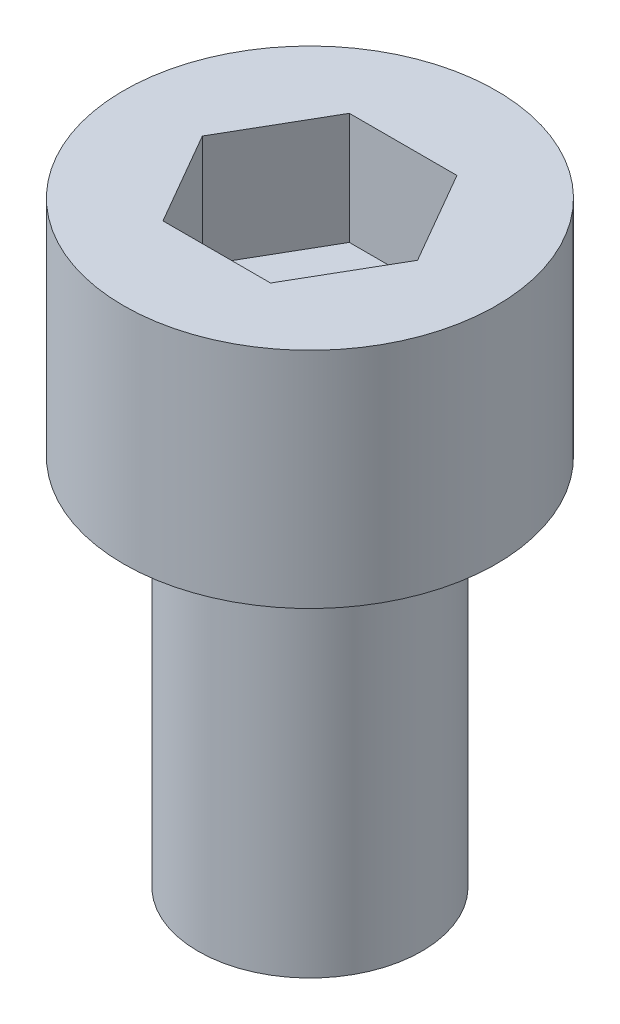
ISO-10303-21;
HEADER;
FILE_DESCRIPTION(('STEP AP214'),'2;1');
FILE_NAME('part.step','',(''),(''),'','','');
FILE_SCHEMA(('AUTOMOTIVE_DESIGN { 1 0 10303 214 1 1 1 1 }'));
ENDSEC;
DATA;
#1=APPLICATION_CONTEXT('core data for automotive mechanical design processes');
#2=APPLICATION_PROTOCOL_DEFINITION('international standard','automotive_design',2000,#1);
#3=PRODUCT_CONTEXT('',#1,'mechanical');
#4=PRODUCT('Part','Part','',(#3));
#5=PRODUCT_RELATED_PRODUCT_CATEGORY('part','',(#4));
#6=PRODUCT_DEFINITION_FORMATION('','',#4);
#7=PRODUCT_DEFINITION_CONTEXT('part definition',#1,'design');
#8=PRODUCT_DEFINITION('design','',#6,#7);
#9=PRODUCT_DEFINITION_SHAPE('','',#8);
#10=(LENGTH_UNIT() NAMED_UNIT(*) SI_UNIT(.MILLI.,.METRE.));
#11=(NAMED_UNIT(*) PLANE_ANGLE_UNIT() SI_UNIT($,.RADIAN.));
#12=(NAMED_UNIT(*) SI_UNIT($,.STERADIAN.) SOLID_ANGLE_UNIT());
#13=UNCERTAINTY_MEASURE_WITH_UNIT(LENGTH_MEASURE(1.E-05),#10,'distance_accuracy_value','');
#14=(GEOMETRIC_REPRESENTATION_CONTEXT(3) GLOBAL_UNCERTAINTY_ASSIGNED_CONTEXT((#13)) GLOBAL_UNIT_ASSIGNED_CONTEXT((#10,
#11,#12)) REPRESENTATION_CONTEXT('',''));
#15=CARTESIAN_POINT('',(0.,0.,0.));
#16=DIRECTION('',(0.,0.,1.));
#17=DIRECTION('',(1.,0.,0.));
#18=AXIS2_PLACEMENT_3D('',#15,#16,#17);
#19=CARTESIAN_POINT('',(0.,-10.,0.));
#20=DIRECTION('',(0.,1.,0.));
#21=DIRECTION('',(0.,0.,1.));
#22=AXIS2_PLACEMENT_3D('',#19,#20,#21);
#23=PLANE('',#22);
#24=CARTESIAN_POINT('',(0.,-9.99999999999999,0.));
#25=DIRECTION('',(0.,1.,0.));
#26=DIRECTION('',(0.,0.,1.));
#27=AXIS2_PLACEMENT_3D('',#24,#25,#26);
#28=CIRCLE('',#27,3.00000000000001);
#29=CARTESIAN_POINT('',(0.,-9.99999999999999,3.00000000000001));
#30=VERTEX_POINT('',#29);
#31=EDGE_CURVE('E11',#30,#30,#28,.T.);
#32=ORIENTED_EDGE('',*,*,#31,.F.);
#33=EDGE_LOOP('',(#32));
#34=FACE_BOUND('',#33,.T.);
#35=ADVANCED_FACE('F35',(#34),#23,.F.);
#36=CARTESIAN_POINT('',(0.,61.6916426261037,0.));
#37=DIRECTION('',(0.,1.,0.));
#38=DIRECTION('',(0.,0.,1.));
#39=AXIS2_PLACEMENT_3D('',#36,#37,#38);
#40=CYLINDRICAL_SURFACE('',#39,3.00000000000001);
#41=CARTESIAN_POINT('',(0.,0.,0.));
#42=DIRECTION('',(0.,1.,0.));
#43=DIRECTION('',(0.,0.,1.));
#44=AXIS2_PLACEMENT_3D('',#41,#42,#43);
#45=CIRCLE('',#44,3.00000000000001);
#46=CARTESIAN_POINT('',(0.,0.,3.00000000000001));
#47=VERTEX_POINT('',#46);
#48=EDGE_CURVE('E42',#47,#47,#45,.T.);
#49=ORIENTED_EDGE('',*,*,#48,.F.);
#50=EDGE_LOOP('',(#49));
#51=FACE_BOUND('',#50,.T.);
#52=ORIENTED_EDGE('',*,*,#31,.T.);
#53=EDGE_LOOP('',(#52));
#54=FACE_BOUND('',#53,.T.);
#55=ADVANCED_FACE('F151',(#51,#54),#40,.T.);
#56=CARTESIAN_POINT('',(3.00000000000001,0.,0.));
#57=DIRECTION('',(0.,1.,0.));
#58=DIRECTION('',(0.,0.,1.));
#59=AXIS2_PLACEMENT_3D('',#56,#57,#58);
#60=PLANE('',#59);
#61=CARTESIAN_POINT('',(0.,0.,0.));
#62=DIRECTION('',(0.,1.,0.));
#63=DIRECTION('',(0.,0.,1.));
#64=AXIS2_PLACEMENT_3D('',#61,#62,#63);
#65=CIRCLE('',#64,5.00000000000001);
#66=CARTESIAN_POINT('',(0.,0.,5.00000000000001));
#67=VERTEX_POINT('',#66);
#68=EDGE_CURVE('E144',#67,#67,#65,.T.);
#69=ORIENTED_EDGE('',*,*,#68,.F.);
#70=EDGE_LOOP('',(#69));
#71=FACE_BOUND('',#70,.T.);
#72=ORIENTED_EDGE('',*,*,#48,.T.);
#73=EDGE_LOOP('',(#72));
#74=FACE_BOUND('',#73,.T.);
#75=ADVANCED_FACE('F149',(#71,#74),#60,.F.);
#76=CARTESIAN_POINT('',(0.,61.6916426261037,0.));
#77=DIRECTION('',(0.,1.,0.));
#78=DIRECTION('',(0.,0.,1.));
#79=AXIS2_PLACEMENT_3D('',#76,#77,#78);
#80=CYLINDRICAL_SURFACE('',#79,5.00000000000001);
#81=CARTESIAN_POINT('',(0.,6.,0.));
#82=DIRECTION('',(0.,1.,0.));
#83=DIRECTION('',(0.,0.,1.));
#84=AXIS2_PLACEMENT_3D('',#81,#82,#83);
#85=CIRCLE('',#84,5.00000000000001);
#86=CARTESIAN_POINT('',(0.,6.,5.00000000000001));
#87=VERTEX_POINT('',#86);
#88=EDGE_CURVE('E136',#87,#87,#85,.T.);
#89=ORIENTED_EDGE('',*,*,#88,.F.);
#90=EDGE_LOOP('',(#89));
#91=FACE_BOUND('',#90,.T.);
#92=ORIENTED_EDGE('',*,*,#68,.T.);
#93=EDGE_LOOP('',(#92));
#94=FACE_BOUND('',#93,.T.);
#95=ADVANCED_FACE('F169',(#91,#94),#80,.T.);
#96=CARTESIAN_POINT('',(5.00000000000001,6.,0.));
#97=DIRECTION('',(0.,-1.,0.));
#98=DIRECTION('',(0.,0.,-1.));
#99=AXIS2_PLACEMENT_3D('',#96,#97,#98);
#100=PLANE('',#99);
#101=DIRECTION('',(-1.,0.,0.));
#102=VECTOR('',#101,1.);
#103=CARTESIAN_POINT('',(1.44337567297406,6.,-2.5));
#104=LINE('',#103,#102);
#105=CARTESIAN_POINT('',(1.44337567297406,6.,-2.5));
#106=VERTEX_POINT('',#105);
#107=CARTESIAN_POINT('',(-1.44337567297406,6.,-2.5));
#108=VERTEX_POINT('',#107);
#109=EDGE_CURVE('E123',#106,#108,#104,.T.);
#110=ORIENTED_EDGE('',*,*,#109,.F.);
#111=DIRECTION('',(-0.5,0.,-0.866025403784439));
#112=VECTOR('',#111,1.);
#113=CARTESIAN_POINT('',(2.88675134594813,6.,0.));
#114=LINE('',#113,#112);
#115=CARTESIAN_POINT('',(2.88675134594813,6.,0.));
#116=VERTEX_POINT('',#115);
#117=EDGE_CURVE('E49',#116,#106,#114,.T.);
#118=ORIENTED_EDGE('',*,*,#117,.F.);
#119=DIRECTION('',(0.5,0.,-0.866025403784439));
#120=VECTOR('',#119,1.);
#121=CARTESIAN_POINT('',(1.44337567297406,6.,2.5));
#122=LINE('',#121,#120);
#123=CARTESIAN_POINT('',(1.44337567297406,6.,2.5));
#124=VERTEX_POINT('',#123);
#125=EDGE_CURVE('E132',#124,#116,#122,.T.);
#126=ORIENTED_EDGE('',*,*,#125,.F.);
#127=DIRECTION('',(1.,0.,0.));
#128=VECTOR('',#127,1.);
#129=CARTESIAN_POINT('',(-1.44337567297406,6.,2.5));
#130=LINE('',#129,#128);
#131=CARTESIAN_POINT('',(-1.44337567297406,6.,2.5));
#132=VERTEX_POINT('',#131);
#133=EDGE_CURVE('E130',#132,#124,#130,.T.);
#134=ORIENTED_EDGE('',*,*,#133,.F.);
#135=DIRECTION('',(0.5,0.,0.866025403784438));
#136=VECTOR('',#135,1.);
#137=CARTESIAN_POINT('',(-2.88675134594813,6.,0.));
#138=LINE('',#137,#136);
#139=CARTESIAN_POINT('',(-2.88675134594813,6.,0.));
#140=VERTEX_POINT('',#139);
#141=EDGE_CURVE('E97',#140,#132,#138,.T.);
#142=ORIENTED_EDGE('',*,*,#141,.F.);
#143=DIRECTION('',(-0.5,0.,0.866025403784439));
#144=VECTOR('',#143,1.);
#145=CARTESIAN_POINT('',(-1.44337567297406,6.,-2.5));
#146=LINE('',#145,#144);
#147=EDGE_CURVE('E126',#108,#140,#146,.T.);
#148=ORIENTED_EDGE('',*,*,#147,.F.);
#149=EDGE_LOOP('',(#110,#118,#126,#134,#142,#148));
#150=FACE_BOUND('',#149,.T.);
#151=ORIENTED_EDGE('',*,*,#88,.T.);
#152=EDGE_LOOP('',(#151));
#153=FACE_BOUND('',#152,.T.);
#154=ADVANCED_FACE('F177',(#150,#153),#100,.F.);
#155=CARTESIAN_POINT('',(2.88675134594813,3.,0.));
#156=DIRECTION('',(0.866025403784439,0.,-0.5));
#157=DIRECTION('',(-0.5,0.,-0.866025403784439));
#158=AXIS2_PLACEMENT_3D('',#155,#156,#157);
#159=PLANE('',#158);
#160=ORIENTED_EDGE('',*,*,#117,.T.);
#161=DIRECTION('',(0.,1.,0.));
#162=VECTOR('',#161,1.);
#163=CARTESIAN_POINT('',(1.44337567297406,3.,-2.5));
#164=LINE('',#163,#162);
#165=CARTESIAN_POINT('',(1.44337567297406,3.,-2.5));
#166=VERTEX_POINT('',#165);
#167=EDGE_CURVE('E79',#166,#106,#164,.T.);
#168=ORIENTED_EDGE('',*,*,#167,.F.);
#169=DIRECTION('',(-0.5,0.,-0.866025403784439));
#170=VECTOR('',#169,1.);
#171=CARTESIAN_POINT('',(2.88675134594813,3.,0.));
#172=LINE('',#171,#170);
#173=CARTESIAN_POINT('',(2.88675134594813,3.,0.));
#174=VERTEX_POINT('',#173);
#175=EDGE_CURVE('E134',#174,#166,#172,.T.);
#176=ORIENTED_EDGE('',*,*,#175,.F.);
#177=DIRECTION('',(0.,1.,0.));
#178=VECTOR('',#177,1.);
#179=CARTESIAN_POINT('',(2.88675134594813,3.,0.));
#180=LINE('',#179,#178);
#181=EDGE_CURVE('E57',#174,#116,#180,.T.);
#182=ORIENTED_EDGE('',*,*,#181,.T.);
#183=EDGE_LOOP('',(#160,#168,#176,#182));
#184=FACE_BOUND('',#183,.T.);
#185=ADVANCED_FACE('F185',(#184),#159,.F.);
#186=CARTESIAN_POINT('',(1.44337567297406,3.,2.5));
#187=DIRECTION('',(0.866025403784439,0.,0.5));
#188=DIRECTION('',(0.5,0.,-0.866025403784439));
#189=AXIS2_PLACEMENT_3D('',#186,#187,#188);
#190=PLANE('',#189);
#191=ORIENTED_EDGE('',*,*,#125,.T.);
#192=ORIENTED_EDGE('',*,*,#181,.F.);
#193=DIRECTION('',(0.5,0.,-0.866025403784439));
#194=VECTOR('',#193,1.);
#195=CARTESIAN_POINT('',(1.44337567297406,3.,2.5));
#196=LINE('',#195,#194);
#197=CARTESIAN_POINT('',(1.44337567297406,3.,2.5));
#198=VERTEX_POINT('',#197);
#199=EDGE_CURVE('E109',#198,#174,#196,.T.);
#200=ORIENTED_EDGE('',*,*,#199,.F.);
#201=DIRECTION('',(0.,1.,0.));
#202=VECTOR('',#201,1.);
#203=CARTESIAN_POINT('',(1.44337567297406,3.,2.5));
#204=LINE('',#203,#202);
#205=EDGE_CURVE('E101',#198,#124,#204,.T.);
#206=ORIENTED_EDGE('',*,*,#205,.T.);
#207=EDGE_LOOP('',(#191,#192,#200,#206));
#208=FACE_BOUND('',#207,.T.);
#209=ADVANCED_FACE('F193',(#208),#190,.F.);
#210=CARTESIAN_POINT('',(-1.44337567297406,3.,2.5));
#211=DIRECTION('',(0.,0.,1.));
#212=DIRECTION('',(1.,0.,0.));
#213=AXIS2_PLACEMENT_3D('',#210,#211,#212);
#214=PLANE('',#213);
#215=ORIENTED_EDGE('',*,*,#133,.T.);
#216=ORIENTED_EDGE('',*,*,#205,.F.);
#217=DIRECTION('',(1.,0.,0.));
#218=VECTOR('',#217,1.);
#219=CARTESIAN_POINT('',(-1.44337567297406,3.,2.5));
#220=LINE('',#219,#218);
#221=CARTESIAN_POINT('',(-1.44337567297406,3.,2.5));
#222=VERTEX_POINT('',#221);
#223=EDGE_CURVE('E105',#222,#198,#220,.T.);
#224=ORIENTED_EDGE('',*,*,#223,.F.);
#225=DIRECTION('',(0.,1.,0.));
#226=VECTOR('',#225,1.);
#227=CARTESIAN_POINT('',(-1.44337567297406,3.,2.5));
#228=LINE('',#227,#226);
#229=EDGE_CURVE('E90',#222,#132,#228,.T.);
#230=ORIENTED_EDGE('',*,*,#229,.T.);
#231=EDGE_LOOP('',(#215,#216,#224,#230));
#232=FACE_BOUND('',#231,.T.);
#233=ADVANCED_FACE('F106',(#232),#214,.F.);
#234=CARTESIAN_POINT('',(-2.88675134594813,3.,0.));
#235=DIRECTION('',(-0.866025403784438,0.,0.5));
#236=DIRECTION('',(0.5,0.,0.866025403784439));
#237=AXIS2_PLACEMENT_3D('',#234,#235,#236);
#238=PLANE('',#237);
#239=ORIENTED_EDGE('',*,*,#141,.T.);
#240=ORIENTED_EDGE('',*,*,#229,.F.);
#241=DIRECTION('',(0.5,0.,0.866025403784438));
#242=VECTOR('',#241,1.);
#243=CARTESIAN_POINT('',(-2.88675134594813,3.,0.));
#244=LINE('',#243,#242);
#245=CARTESIAN_POINT('',(-2.88675134594813,3.,0.));
#246=VERTEX_POINT('',#245);
#247=EDGE_CURVE('E94',#246,#222,#244,.T.);
#248=ORIENTED_EDGE('',*,*,#247,.F.);
#249=DIRECTION('',(0.,1.,0.));
#250=VECTOR('',#249,1.);
#251=CARTESIAN_POINT('',(-2.88675134594813,3.,0.));
#252=LINE('',#251,#250);
#253=EDGE_CURVE('E102',#246,#140,#252,.T.);
#254=ORIENTED_EDGE('',*,*,#253,.T.);
#255=EDGE_LOOP('',(#239,#240,#248,#254));
#256=FACE_BOUND('',#255,.T.);
#257=ADVANCED_FACE('F92',(#256),#238,.F.);
#258=CARTESIAN_POINT('',(-1.44337567297406,3.,-2.5));
#259=DIRECTION('',(-0.866025403784439,0.,-0.5));
#260=DIRECTION('',(-0.5,0.,0.866025403784439));
#261=AXIS2_PLACEMENT_3D('',#258,#259,#260);
#262=PLANE('',#261);
#263=ORIENTED_EDGE('',*,*,#147,.T.);
#264=ORIENTED_EDGE('',*,*,#253,.F.);
#265=DIRECTION('',(-0.5,0.,0.866025403784439));
#266=VECTOR('',#265,1.);
#267=CARTESIAN_POINT('',(-1.44337567297406,3.,-2.5));
#268=LINE('',#267,#266);
#269=CARTESIAN_POINT('',(-1.44337567297406,3.,-2.5));
#270=VERTEX_POINT('',#269);
#271=EDGE_CURVE('E115',#270,#246,#268,.T.);
#272=ORIENTED_EDGE('',*,*,#271,.F.);
#273=DIRECTION('',(0.,1.,0.));
#274=VECTOR('',#273,1.);
#275=CARTESIAN_POINT('',(-1.44337567297406,3.,-2.5));
#276=LINE('',#275,#274);
#277=EDGE_CURVE('E139',#270,#108,#276,.T.);
#278=ORIENTED_EDGE('',*,*,#277,.T.);
#279=EDGE_LOOP('',(#263,#264,#272,#278));
#280=FACE_BOUND('',#279,.T.);
#281=ADVANCED_FACE('F212',(#280),#262,.F.);
#282=CARTESIAN_POINT('',(1.44337567297406,3.,-2.5));
#283=DIRECTION('',(0.,0.,-1.));
#284=DIRECTION('',(-1.,0.,0.));
#285=AXIS2_PLACEMENT_3D('',#282,#283,#284);
#286=PLANE('',#285);
#287=ORIENTED_EDGE('',*,*,#109,.T.);
#288=ORIENTED_EDGE('',*,*,#277,.F.);
#289=DIRECTION('',(-1.,0.,0.));
#290=VECTOR('',#289,1.);
#291=CARTESIAN_POINT('',(1.44337567297406,3.,-2.5));
#292=LINE('',#291,#290);
#293=EDGE_CURVE('E117',#166,#270,#292,.T.);
#294=ORIENTED_EDGE('',*,*,#293,.F.);
#295=ORIENTED_EDGE('',*,*,#167,.T.);
#296=EDGE_LOOP('',(#287,#288,#294,#295));
#297=FACE_BOUND('',#296,.T.);
#298=ADVANCED_FACE('F219',(#297),#286,.F.);
#299=CARTESIAN_POINT('',(0.,3.,-5.));
#300=DIRECTION('',(0.,1.,0.));
#301=DIRECTION('',(0.,0.,1.));
#302=AXIS2_PLACEMENT_3D('',#299,#300,#301);
#303=PLANE('',#302);
#304=ORIENTED_EDGE('',*,*,#175,.T.);
#305=ORIENTED_EDGE('',*,*,#293,.T.);
#306=ORIENTED_EDGE('',*,*,#271,.T.);
#307=ORIENTED_EDGE('',*,*,#247,.T.);
#308=ORIENTED_EDGE('',*,*,#223,.T.);
#309=ORIENTED_EDGE('',*,*,#199,.T.);
#310=EDGE_LOOP('',(#304,#305,#306,#307,#308,#309));
#311=FACE_BOUND('',#310,.T.);
#312=ADVANCED_FACE('F112',(#311),#303,.T.);
#313=CLOSED_SHELL('',(#35,#55,#75,#95,#154,#185,#209,#233,#257,#281,#298,#312));
#314=MANIFOLD_SOLID_BREP('B2',#313);
#315=ADVANCED_BREP_SHAPE_REPRESENTATION('',(#18,#314),#14);
#316=SHAPE_DEFINITION_REPRESENTATION(#9,#315);
ENDSEC;
END-ISO-10303-21;
